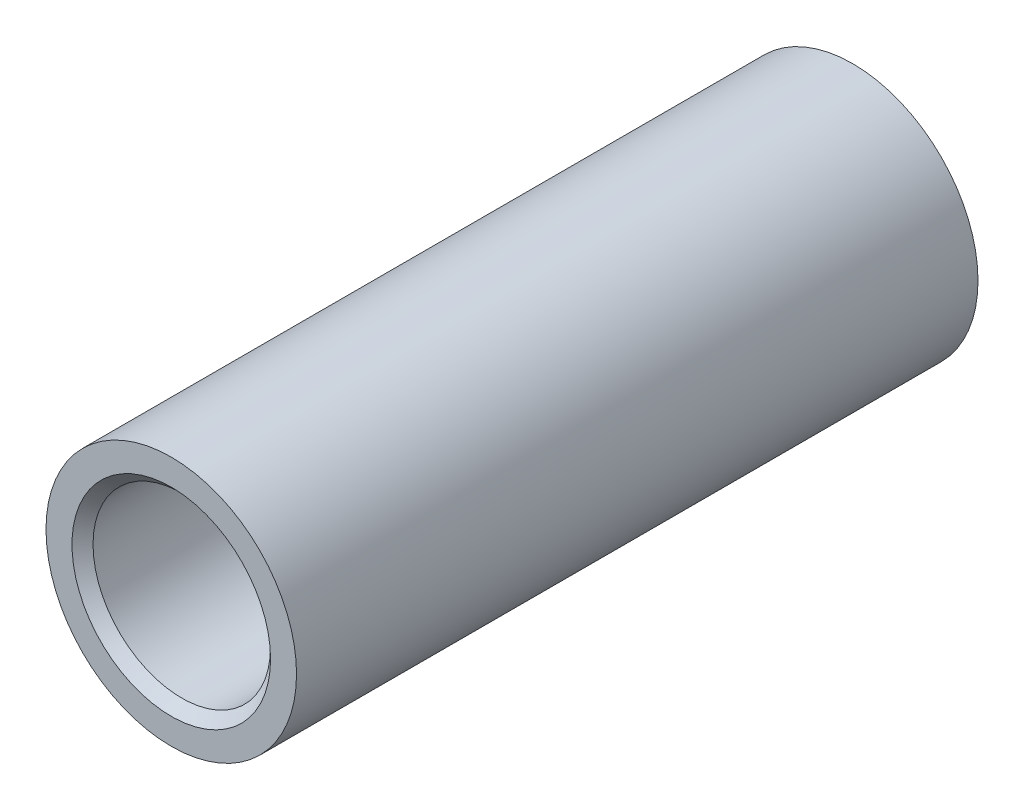
ISO-10303-21;
HEADER;
FILE_DESCRIPTION(('STEP AP214'),'2;1');
FILE_NAME('part.step','',(''),(''),'','','');
FILE_SCHEMA(('AUTOMOTIVE_DESIGN { 1 0 10303 214 1 1 1 1 }'));
ENDSEC;
DATA;
#1=APPLICATION_CONTEXT('core data for automotive mechanical design processes');
#2=APPLICATION_PROTOCOL_DEFINITION('international standard','automotive_design',2000,#1);
#3=PRODUCT_CONTEXT('',#1,'mechanical');
#4=PRODUCT('Part','Part','',(#3));
#5=PRODUCT_RELATED_PRODUCT_CATEGORY('part','',(#4));
#6=PRODUCT_DEFINITION_FORMATION('','',#4);
#7=PRODUCT_DEFINITION_CONTEXT('part definition',#1,'design');
#8=PRODUCT_DEFINITION('design','',#6,#7);
#9=PRODUCT_DEFINITION_SHAPE('','',#8);
#10=(LENGTH_UNIT() NAMED_UNIT(*) SI_UNIT(.MILLI.,.METRE.));
#11=(NAMED_UNIT(*) PLANE_ANGLE_UNIT() SI_UNIT($,.RADIAN.));
#12=(NAMED_UNIT(*) SI_UNIT($,.STERADIAN.) SOLID_ANGLE_UNIT());
#13=UNCERTAINTY_MEASURE_WITH_UNIT(LENGTH_MEASURE(1.E-05),#10,'distance_accuracy_value','');
#14=(GEOMETRIC_REPRESENTATION_CONTEXT(3) GLOBAL_UNCERTAINTY_ASSIGNED_CONTEXT((#13)) GLOBAL_UNIT_ASSIGNED_CONTEXT((#10,
#11,#12)) REPRESENTATION_CONTEXT('',''));
#15=CARTESIAN_POINT('',(0.,0.,0.));
#16=DIRECTION('',(0.,0.,1.));
#17=DIRECTION('',(1.,0.,0.));
#18=AXIS2_PLACEMENT_3D('',#15,#16,#17);
#19=CARTESIAN_POINT('',(0.,0.,25.908));
#20=DIRECTION('',(0.,0.,1.));
#21=DIRECTION('',(1.,0.,0.));
#22=AXIS2_PLACEMENT_3D('',#19,#20,#21);
#23=PLANE('',#22);
#24=CARTESIAN_POINT('',(0.,0.,25.908));
#25=DIRECTION('',(0.,0.,1.));
#26=DIRECTION('',(1.,0.,0.));
#27=AXIS2_PLACEMENT_3D('',#24,#25,#26);
#28=CIRCLE('',#27,3.775);
#29=CARTESIAN_POINT('',(3.775,0.,25.908));
#30=VERTEX_POINT('',#29);
#31=EDGE_CURVE('E10',#30,#30,#28,.F.);
#32=ORIENTED_EDGE('',*,*,#31,.T.);
#33=EDGE_LOOP('',(#32));
#34=FACE_BOUND('',#33,.T.);
#35=CARTESIAN_POINT('',(0.,0.,25.908));
#36=DIRECTION('',(0.,0.,1.));
#37=DIRECTION('',(1.,0.,0.));
#38=AXIS2_PLACEMENT_3D('',#35,#36,#37);
#39=CIRCLE('',#38,4.7625);
#40=CARTESIAN_POINT('',(4.7625,0.,25.908));
#41=VERTEX_POINT('',#40);
#42=EDGE_CURVE('E51',#41,#41,#39,.T.);
#43=ORIENTED_EDGE('',*,*,#42,.T.);
#44=EDGE_LOOP('',(#43));
#45=FACE_BOUND('',#44,.T.);
#46=ADVANCED_FACE('F31',(#34,#45),#23,.T.);
#47=CARTESIAN_POINT('',(0.,0.,0.));
#48=DIRECTION('',(0.,0.,1.));
#49=DIRECTION('',(1.,0.,0.));
#50=AXIS2_PLACEMENT_3D('',#47,#48,#49);
#51=PLANE('',#50);
#52=CARTESIAN_POINT('',(0.,0.,0.));
#53=DIRECTION('',(0.,0.,1.));
#54=DIRECTION('',(1.,0.,0.));
#55=AXIS2_PLACEMENT_3D('',#52,#53,#54);
#56=CIRCLE('',#55,3.775);
#57=CARTESIAN_POINT('',(3.775,0.,0.));
#58=VERTEX_POINT('',#57);
#59=EDGE_CURVE('E46',#58,#58,#56,.T.);
#60=ORIENTED_EDGE('',*,*,#59,.T.);
#61=EDGE_LOOP('',(#60));
#62=FACE_BOUND('',#61,.T.);
#63=CARTESIAN_POINT('',(0.,0.,0.));
#64=DIRECTION('',(0.,0.,1.));
#65=DIRECTION('',(1.,0.,0.));
#66=AXIS2_PLACEMENT_3D('',#63,#64,#65);
#67=CIRCLE('',#66,4.7625);
#68=CARTESIAN_POINT('',(4.7625,0.,0.));
#69=VERTEX_POINT('',#68);
#70=EDGE_CURVE('E52',#69,#69,#67,.T.);
#71=ORIENTED_EDGE('',*,*,#70,.F.);
#72=EDGE_LOOP('',(#71));
#73=FACE_BOUND('',#72,.T.);
#74=ADVANCED_FACE('F63',(#62,#73),#51,.F.);
#75=CARTESIAN_POINT('',(0.,0.,25.908));
#76=DIRECTION('',(0.,0.,-1.));
#77=DIRECTION('',(-1.,0.,0.));
#78=AXIS2_PLACEMENT_3D('',#75,#76,#77);
#79=CYLINDRICAL_SURFACE('',#78,4.7625);
#80=ORIENTED_EDGE('',*,*,#42,.F.);
#81=EDGE_LOOP('',(#80));
#82=FACE_BOUND('',#81,.T.);
#83=ORIENTED_EDGE('',*,*,#70,.T.);
#84=EDGE_LOOP('',(#83));
#85=FACE_BOUND('',#84,.T.);
#86=ADVANCED_FACE('F59',(#82,#85),#79,.T.);
#87=CARTESIAN_POINT('',(0.,0.,25.908));
#88=DIRECTION('',(0.,0.,-1.));
#89=DIRECTION('',(-1.,0.,0.));
#90=AXIS2_PLACEMENT_3D('',#87,#88,#89);
#91=CYLINDRICAL_SURFACE('',#90,3.375);
#92=CARTESIAN_POINT('',(0.,0.,0.400000000000001));
#93=DIRECTION('',(0.,0.,1.));
#94=DIRECTION('',(1.,0.,0.));
#95=AXIS2_PLACEMENT_3D('',#92,#93,#94);
#96=CIRCLE('',#95,3.375);
#97=CARTESIAN_POINT('',(3.375,0.,0.400000000000001));
#98=VERTEX_POINT('',#97);
#99=EDGE_CURVE('E38',#98,#98,#96,.F.);
#100=ORIENTED_EDGE('',*,*,#99,.T.);
#101=EDGE_LOOP('',(#100));
#102=FACE_BOUND('',#101,.T.);
#103=CARTESIAN_POINT('',(0.,0.,25.508));
#104=DIRECTION('',(0.,0.,1.));
#105=DIRECTION('',(1.,0.,0.));
#106=AXIS2_PLACEMENT_3D('',#103,#104,#105);
#107=CIRCLE('',#106,3.375);
#108=CARTESIAN_POINT('',(3.375,0.,25.508));
#109=VERTEX_POINT('',#108);
#110=EDGE_CURVE('E42',#109,#109,#107,.T.);
#111=ORIENTED_EDGE('',*,*,#110,.T.);
#112=EDGE_LOOP('',(#111));
#113=FACE_BOUND('',#112,.T.);
#114=ADVANCED_FACE('F62',(#102,#113),#91,.F.);
#115=CARTESIAN_POINT('',(0.,0.,0.));
#116=DIRECTION('',(0.,0.,-1.));
#117=DIRECTION('',(-1.,0.,0.));
#118=AXIS2_PLACEMENT_3D('',#115,#116,#117);
#119=CONICAL_SURFACE('',#118,3.775,0.785398163397448);
#120=ORIENTED_EDGE('',*,*,#99,.F.);
#121=EDGE_LOOP('',(#120));
#122=FACE_BOUND('',#121,.T.);
#123=ORIENTED_EDGE('',*,*,#59,.F.);
#124=EDGE_LOOP('',(#123));
#125=FACE_BOUND('',#124,.T.);
#126=ADVANCED_FACE('F75',(#122,#125),#119,.F.);
#127=CARTESIAN_POINT('',(0.,0.,25.508));
#128=DIRECTION('',(0.,0.,1.));
#129=DIRECTION('',(1.,0.,0.));
#130=AXIS2_PLACEMENT_3D('',#127,#128,#129);
#131=CONICAL_SURFACE('',#130,3.375,0.78539816339744);
#132=ORIENTED_EDGE('',*,*,#31,.F.);
#133=EDGE_LOOP('',(#132));
#134=FACE_BOUND('',#133,.T.);
#135=ORIENTED_EDGE('',*,*,#110,.F.);
#136=EDGE_LOOP('',(#135));
#137=FACE_BOUND('',#136,.T.);
#138=ADVANCED_FACE('F33',(#134,#137),#131,.F.);
#139=CLOSED_SHELL('',(#46,#74,#86,#114,#126,#138));
#140=MANIFOLD_SOLID_BREP('B2',#139);
#141=ADVANCED_BREP_SHAPE_REPRESENTATION('',(#18,#140),#14);
#142=SHAPE_DEFINITION_REPRESENTATION(#9,#141);
ENDSEC;
END-ISO-10303-21;
